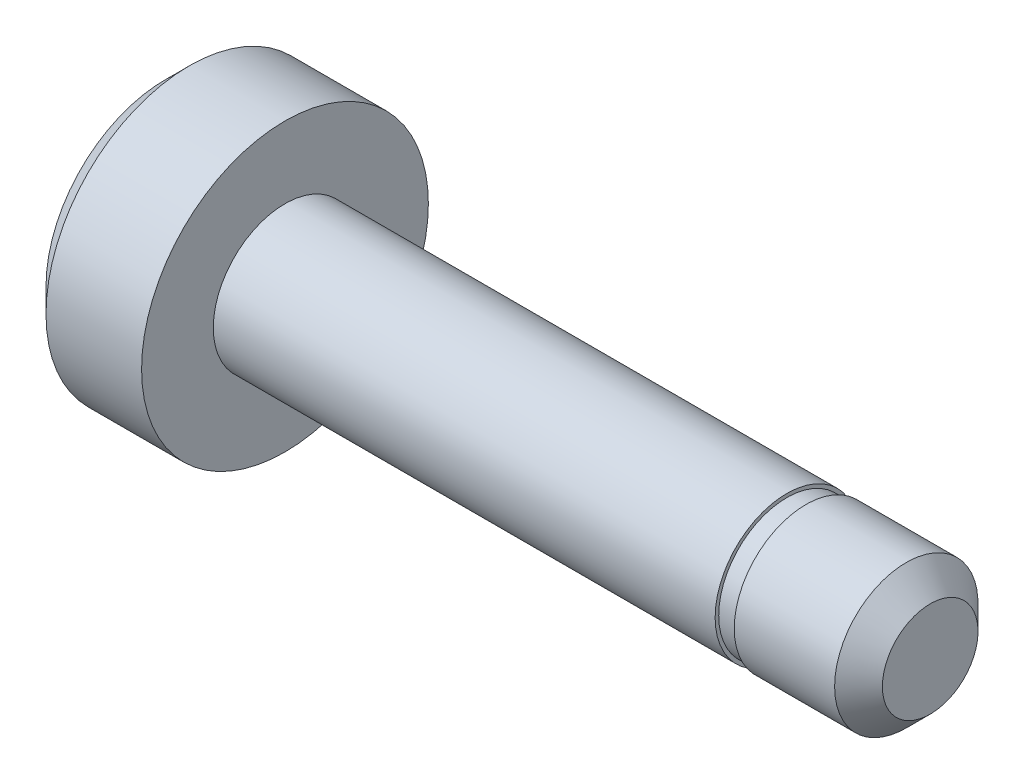
ISO-10303-21;
HEADER;
FILE_DESCRIPTION(('STEP AP214'),'2;1');
FILE_NAME('part.step','',(''),(''),'','','');
FILE_SCHEMA(('AUTOMOTIVE_DESIGN { 1 0 10303 214 1 1 1 1 }'));
ENDSEC;
DATA;
#1=APPLICATION_CONTEXT('core data for automotive mechanical design processes');
#2=APPLICATION_PROTOCOL_DEFINITION('international standard','automotive_design',2000,#1);
#3=PRODUCT_CONTEXT('',#1,'mechanical');
#4=PRODUCT('Part','Part','',(#3));
#5=PRODUCT_RELATED_PRODUCT_CATEGORY('part','',(#4));
#6=PRODUCT_DEFINITION_FORMATION('','',#4);
#7=PRODUCT_DEFINITION_CONTEXT('part definition',#1,'design');
#8=PRODUCT_DEFINITION('design','',#6,#7);
#9=PRODUCT_DEFINITION_SHAPE('','',#8);
#10=(LENGTH_UNIT() NAMED_UNIT(*) SI_UNIT(.MILLI.,.METRE.));
#11=(NAMED_UNIT(*) PLANE_ANGLE_UNIT() SI_UNIT($,.RADIAN.));
#12=(NAMED_UNIT(*) SI_UNIT($,.STERADIAN.) SOLID_ANGLE_UNIT());
#13=UNCERTAINTY_MEASURE_WITH_UNIT(LENGTH_MEASURE(1.E-05),#10,'distance_accuracy_value','');
#14=(GEOMETRIC_REPRESENTATION_CONTEXT(3) GLOBAL_UNCERTAINTY_ASSIGNED_CONTEXT((#13)) GLOBAL_UNIT_ASSIGNED_CONTEXT((#10,
#11,#12)) REPRESENTATION_CONTEXT('',''));
#15=CARTESIAN_POINT('',(0.,0.,0.));
#16=DIRECTION('',(0.,0.,1.));
#17=DIRECTION('',(1.,0.,0.));
#18=AXIS2_PLACEMENT_3D('',#15,#16,#17);
#19=CARTESIAN_POINT('',(-27.0938896189225,0.,0.));
#20=DIRECTION('',(-1.,0.,0.));
#21=DIRECTION('',(0.,0.,1.));
#22=AXIS2_PLACEMENT_3D('',#19,#20,#21);
#23=CYLINDRICAL_SURFACE('',#22,3.);
#24=CARTESIAN_POINT('',(0.,0.,0.));
#25=DIRECTION('',(-1.,0.,0.));
#26=DIRECTION('',(0.,0.,1.));
#27=AXIS2_PLACEMENT_3D('',#24,#25,#26);
#28=CIRCLE('',#27,3.);
#29=CARTESIAN_POINT('',(0.,0.,3.));
#30=VERTEX_POINT('',#29);
#31=EDGE_CURVE('E10',#30,#30,#28,.T.);
#32=ORIENTED_EDGE('',*,*,#31,.F.);
#33=EDGE_LOOP('',(#32));
#34=FACE_BOUND('',#33,.T.);
#35=CARTESIAN_POINT('',(21.,0.,0.));
#36=DIRECTION('',(-1.,0.,0.));
#37=DIRECTION('',(0.,0.,1.));
#38=AXIS2_PLACEMENT_3D('',#35,#36,#37);
#39=CIRCLE('',#38,3.);
#40=CARTESIAN_POINT('',(21.,0.,3.));
#41=VERTEX_POINT('',#40);
#42=EDGE_CURVE('E80',#41,#41,#39,.T.);
#43=ORIENTED_EDGE('',*,*,#42,.T.);
#44=EDGE_LOOP('',(#43));
#45=FACE_BOUND('',#44,.T.);
#46=ADVANCED_FACE('F37',(#34,#45),#23,.T.);
#47=CARTESIAN_POINT('',(0.,3.,0.));
#48=DIRECTION('',(-1.,0.,0.));
#49=DIRECTION('',(0.,0.,1.));
#50=AXIS2_PLACEMENT_3D('',#47,#48,#49);
#51=PLANE('',#50);
#52=CARTESIAN_POINT('',(0.,0.,0.));
#53=DIRECTION('',(-1.,0.,0.));
#54=DIRECTION('',(0.,0.,1.));
#55=AXIS2_PLACEMENT_3D('',#52,#53,#54);
#56=CIRCLE('',#55,6.);
#57=CARTESIAN_POINT('',(0.,0.,6.));
#58=VERTEX_POINT('',#57);
#59=EDGE_CURVE('E44',#58,#58,#56,.T.);
#60=ORIENTED_EDGE('',*,*,#59,.F.);
#61=EDGE_LOOP('',(#60));
#62=FACE_BOUND('',#61,.T.);
#63=ORIENTED_EDGE('',*,*,#31,.T.);
#64=EDGE_LOOP('',(#63));
#65=FACE_BOUND('',#64,.T.);
#66=ADVANCED_FACE('F127',(#62,#65),#51,.F.);
#67=CARTESIAN_POINT('',(-27.0938896189225,0.,0.));
#68=DIRECTION('',(-1.,0.,0.));
#69=DIRECTION('',(0.,0.,1.));
#70=AXIS2_PLACEMENT_3D('',#67,#68,#69);
#71=CYLINDRICAL_SURFACE('',#70,6.);
#72=CARTESIAN_POINT('',(-4.,0.,0.));
#73=DIRECTION('',(-1.,0.,0.));
#74=DIRECTION('',(0.,0.,1.));
#75=AXIS2_PLACEMENT_3D('',#72,#73,#74);
#76=CIRCLE('',#75,6.);
#77=CARTESIAN_POINT('',(-4.,0.,6.));
#78=VERTEX_POINT('',#77);
#79=EDGE_CURVE('E50',#78,#78,#76,.T.);
#80=ORIENTED_EDGE('',*,*,#79,.F.);
#81=EDGE_LOOP('',(#80));
#82=FACE_BOUND('',#81,.T.);
#83=ORIENTED_EDGE('',*,*,#59,.T.);
#84=EDGE_LOOP('',(#83));
#85=FACE_BOUND('',#84,.T.);
#86=ADVANCED_FACE('F132',(#82,#85),#71,.T.);
#87=CARTESIAN_POINT('',(-4.,0.,0.));
#88=DIRECTION('',(1.,0.,0.));
#89=DIRECTION('',(0.,0.,-1.));
#90=AXIS2_PLACEMENT_3D('',#87,#88,#89);
#91=CONICAL_SURFACE('',#90,6.,0.785398163397448);
#92=CARTESIAN_POINT('',(-5.,0.,0.));
#93=DIRECTION('',(-1.,0.,0.));
#94=DIRECTION('',(0.,0.,1.));
#95=AXIS2_PLACEMENT_3D('',#92,#93,#94);
#96=CIRCLE('',#95,5.);
#97=CARTESIAN_POINT('',(-5.,0.,5.));
#98=VERTEX_POINT('',#97);
#99=EDGE_CURVE('E57',#98,#98,#96,.T.);
#100=ORIENTED_EDGE('',*,*,#99,.F.);
#101=EDGE_LOOP('',(#100));
#102=FACE_BOUND('',#101,.T.);
#103=ORIENTED_EDGE('',*,*,#79,.T.);
#104=EDGE_LOOP('',(#103));
#105=FACE_BOUND('',#104,.T.);
#106=ADVANCED_FACE('F123',(#102,#105),#91,.T.);
#107=CARTESIAN_POINT('',(-5.,5.,0.));
#108=DIRECTION('',(1.,0.,0.));
#109=DIRECTION('',(0.,0.,-1.));
#110=AXIS2_PLACEMENT_3D('',#107,#108,#109);
#111=PLANE('',#110);
#112=ORIENTED_EDGE('',*,*,#99,.T.);
#113=EDGE_LOOP('',(#112));
#114=FACE_BOUND('',#113,.T.);
#115=ADVANCED_FACE('F118',(#114),#111,.F.);
#116=CARTESIAN_POINT('',(27.,2.,0.));
#117=DIRECTION('',(-1.,0.,0.));
#118=DIRECTION('',(0.,0.,1.));
#119=AXIS2_PLACEMENT_3D('',#116,#117,#118);
#120=PLANE('',#119);
#121=CARTESIAN_POINT('',(27.,0.,0.));
#122=DIRECTION('',(-1.,0.,0.));
#123=DIRECTION('',(0.,0.,1.));
#124=AXIS2_PLACEMENT_3D('',#121,#122,#123);
#125=CIRCLE('',#124,2.);
#126=CARTESIAN_POINT('',(27.,0.,2.));
#127=VERTEX_POINT('',#126);
#128=EDGE_CURVE('E63',#127,#127,#125,.T.);
#129=ORIENTED_EDGE('',*,*,#128,.F.);
#130=EDGE_LOOP('',(#129));
#131=FACE_BOUND('',#130,.T.);
#132=ADVANCED_FACE('F113',(#131),#120,.F.);
#133=CARTESIAN_POINT('',(27.,0.,0.));
#134=DIRECTION('',(-1.,0.,0.));
#135=DIRECTION('',(0.,0.,1.));
#136=AXIS2_PLACEMENT_3D('',#133,#134,#135);
#137=CONICAL_SURFACE('',#136,2.,0.785398163397448);
#138=CARTESIAN_POINT('',(26.,0.,0.));
#139=DIRECTION('',(-1.,0.,0.));
#140=DIRECTION('',(0.,0.,1.));
#141=AXIS2_PLACEMENT_3D('',#138,#139,#140);
#142=CIRCLE('',#141,3.);
#143=CARTESIAN_POINT('',(26.,0.,3.));
#144=VERTEX_POINT('',#143);
#145=EDGE_CURVE('E67',#144,#144,#142,.T.);
#146=ORIENTED_EDGE('',*,*,#145,.F.);
#147=EDGE_LOOP('',(#146));
#148=FACE_BOUND('',#147,.T.);
#149=ORIENTED_EDGE('',*,*,#128,.T.);
#150=EDGE_LOOP('',(#149));
#151=FACE_BOUND('',#150,.T.);
#152=ADVANCED_FACE('F107',(#148,#151),#137,.T.);
#153=CARTESIAN_POINT('',(-27.0938896189225,0.,0.));
#154=DIRECTION('',(-1.,0.,0.));
#155=DIRECTION('',(0.,0.,1.));
#156=AXIS2_PLACEMENT_3D('',#153,#154,#155);
#157=CYLINDRICAL_SURFACE('',#156,3.);
#158=CARTESIAN_POINT('',(21.8,0.,0.));
#159=DIRECTION('',(-1.,0.,0.));
#160=DIRECTION('',(0.,0.,1.));
#161=AXIS2_PLACEMENT_3D('',#158,#159,#160);
#162=CIRCLE('',#161,3.);
#163=CARTESIAN_POINT('',(21.8,0.,3.));
#164=VERTEX_POINT('',#163);
#165=EDGE_CURVE('E70',#164,#164,#162,.T.);
#166=ORIENTED_EDGE('',*,*,#165,.F.);
#167=EDGE_LOOP('',(#166));
#168=FACE_BOUND('',#167,.T.);
#169=ORIENTED_EDGE('',*,*,#145,.T.);
#170=EDGE_LOOP('',(#169));
#171=FACE_BOUND('',#170,.T.);
#172=ADVANCED_FACE('F101',(#168,#171),#157,.T.);
#173=CARTESIAN_POINT('',(21.8,3.,0.));
#174=DIRECTION('',(1.,0.,0.));
#175=DIRECTION('',(0.,0.,-1.));
#176=AXIS2_PLACEMENT_3D('',#173,#174,#175);
#177=PLANE('',#176);
#178=CARTESIAN_POINT('',(21.8,0.,0.));
#179=DIRECTION('',(-1.,0.,0.));
#180=DIRECTION('',(0.,0.,1.));
#181=AXIS2_PLACEMENT_3D('',#178,#179,#180);
#182=CIRCLE('',#181,2.85);
#183=CARTESIAN_POINT('',(21.8,0.,2.85));
#184=VERTEX_POINT('',#183);
#185=EDGE_CURVE('E74',#184,#184,#182,.T.);
#186=ORIENTED_EDGE('',*,*,#185,.F.);
#187=EDGE_LOOP('',(#186));
#188=FACE_BOUND('',#187,.T.);
#189=ORIENTED_EDGE('',*,*,#165,.T.);
#190=EDGE_LOOP('',(#189));
#191=FACE_BOUND('',#190,.T.);
#192=ADVANCED_FACE('F95',(#188,#191),#177,.F.);
#193=CARTESIAN_POINT('',(-27.0938896189225,0.,0.));
#194=DIRECTION('',(-1.,0.,0.));
#195=DIRECTION('',(0.,0.,1.));
#196=AXIS2_PLACEMENT_3D('',#193,#194,#195);
#197=CYLINDRICAL_SURFACE('',#196,2.85);
#198=CARTESIAN_POINT('',(21.,0.,0.));
#199=DIRECTION('',(-1.,0.,0.));
#200=DIRECTION('',(0.,0.,1.));
#201=AXIS2_PLACEMENT_3D('',#198,#199,#200);
#202=CIRCLE('',#201,2.85);
#203=CARTESIAN_POINT('',(21.,0.,2.85));
#204=VERTEX_POINT('',#203);
#205=EDGE_CURVE('E77',#204,#204,#202,.T.);
#206=ORIENTED_EDGE('',*,*,#205,.F.);
#207=EDGE_LOOP('',(#206));
#208=FACE_BOUND('',#207,.T.);
#209=ORIENTED_EDGE('',*,*,#185,.T.);
#210=EDGE_LOOP('',(#209));
#211=FACE_BOUND('',#210,.T.);
#212=ADVANCED_FACE('F89',(#208,#211),#197,.T.);
#213=CARTESIAN_POINT('',(21.,2.85,0.));
#214=DIRECTION('',(-1.,0.,0.));
#215=DIRECTION('',(0.,0.,1.));
#216=AXIS2_PLACEMENT_3D('',#213,#214,#215);
#217=PLANE('',#216);
#218=ORIENTED_EDGE('',*,*,#42,.F.);
#219=EDGE_LOOP('',(#218));
#220=FACE_BOUND('',#219,.T.);
#221=ORIENTED_EDGE('',*,*,#205,.T.);
#222=EDGE_LOOP('',(#221));
#223=FACE_BOUND('',#222,.T.);
#224=ADVANCED_FACE('F86',(#220,#223),#217,.F.);
#225=CLOSED_SHELL('',(#46,#66,#86,#106,#115,#132,#152,#172,#192,#212,#224));
#226=MANIFOLD_SOLID_BREP('B2',#225);
#227=ADVANCED_BREP_SHAPE_REPRESENTATION('',(#18,#226),#14);
#228=SHAPE_DEFINITION_REPRESENTATION(#9,#227);
ENDSEC;
END-ISO-10303-21;
